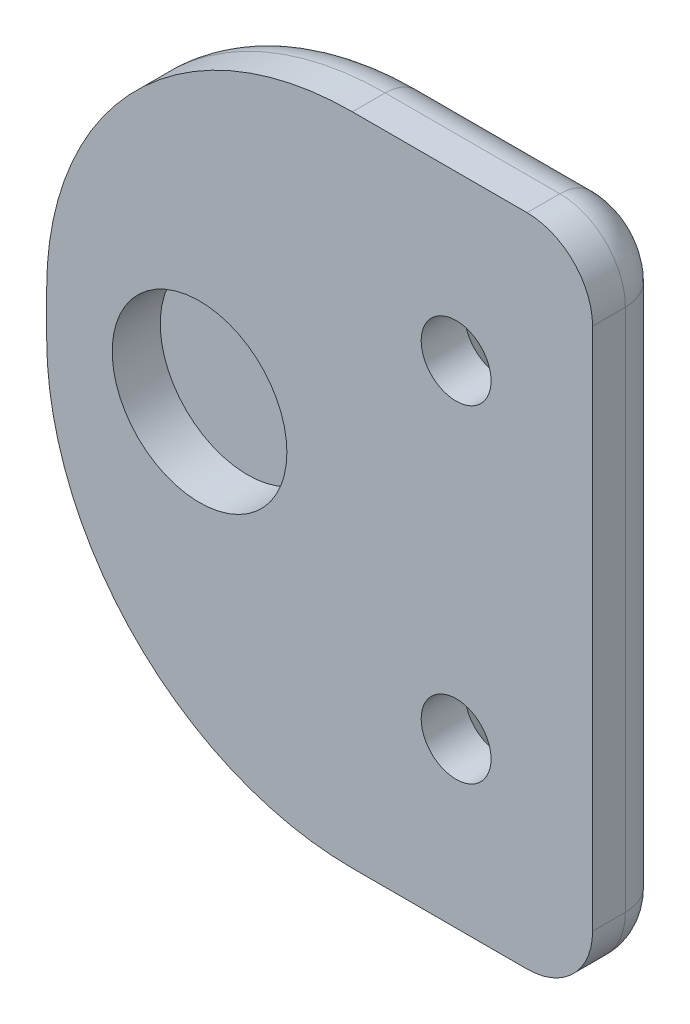
ISO-10303-21;
HEADER;
FILE_DESCRIPTION(('STEP AP214'),'2;1');
FILE_NAME('part.step','',(''),(''),'','','');
FILE_SCHEMA(('AUTOMOTIVE_DESIGN { 1 0 10303 214 1 1 1 1 }'));
ENDSEC;
DATA;
#1=APPLICATION_CONTEXT('core data for automotive mechanical design processes');
#2=APPLICATION_PROTOCOL_DEFINITION('international standard','automotive_design',2000,#1);
#3=PRODUCT_CONTEXT('',#1,'mechanical');
#4=PRODUCT('Part','Part','',(#3));
#5=PRODUCT_RELATED_PRODUCT_CATEGORY('part','',(#4));
#6=PRODUCT_DEFINITION_FORMATION('','',#4);
#7=PRODUCT_DEFINITION_CONTEXT('part definition',#1,'design');
#8=PRODUCT_DEFINITION('design','',#6,#7);
#9=PRODUCT_DEFINITION_SHAPE('','',#8);
#10=(LENGTH_UNIT() NAMED_UNIT(*) SI_UNIT(.MILLI.,.METRE.));
#11=(NAMED_UNIT(*) PLANE_ANGLE_UNIT() SI_UNIT($,.RADIAN.));
#12=(NAMED_UNIT(*) SI_UNIT($,.STERADIAN.) SOLID_ANGLE_UNIT());
#13=UNCERTAINTY_MEASURE_WITH_UNIT(LENGTH_MEASURE(1.E-05),#10,'distance_accuracy_value','');
#14=(GEOMETRIC_REPRESENTATION_CONTEXT(3) GLOBAL_UNCERTAINTY_ASSIGNED_CONTEXT((#13)) GLOBAL_UNIT_ASSIGNED_CONTEXT((#10,
#11,#12)) REPRESENTATION_CONTEXT('',''));
#15=CARTESIAN_POINT('',(0.,0.,0.));
#16=DIRECTION('',(0.,0.,1.));
#17=DIRECTION('',(1.,0.,0.));
#18=AXIS2_PLACEMENT_3D('',#15,#16,#17);
#19=CARTESIAN_POINT('',(9.50000000000001,-12.,3.5));
#20=DIRECTION('',(0.,0.,-1.));
#21=DIRECTION('',(-1.,0.,0.));
#22=AXIS2_PLACEMENT_3D('',#19,#20,#21);
#23=PLANE('',#22);
#24=CARTESIAN_POINT('',(-5.49999999999999,0.,3.5));
#25=DIRECTION('',(0.,0.,1.));
#26=DIRECTION('',(1.,0.,0.));
#27=AXIS2_PLACEMENT_3D('',#24,#25,#26);
#28=CIRCLE('',#27,4.);
#29=CARTESIAN_POINT('',(-1.49999999999999,0.,3.5));
#30=VERTEX_POINT('',#29);
#31=EDGE_CURVE('E203',#30,#30,#28,.T.);
#32=ORIENTED_EDGE('',*,*,#31,.F.);
#33=EDGE_LOOP('',(#32));
#34=FACE_BOUND('',#33,.T.);
#35=CARTESIAN_POINT('',(9.50000000000001,-12.,3.5));
#36=DIRECTION('',(0.,0.,1.));
#37=DIRECTION('',(-1.,0.,0.));
#38=AXIS2_PLACEMENT_3D('',#35,#36,#37);
#39=CIRCLE('',#38,3.);
#40=CARTESIAN_POINT('',(9.49999999999998,-15.,3.5));
#41=VERTEX_POINT('',#40);
#42=CARTESIAN_POINT('',(12.5,-12.,3.5));
#43=VERTEX_POINT('',#42);
#44=EDGE_CURVE('E130',#41,#43,#39,.T.);
#45=ORIENTED_EDGE('',*,*,#44,.T.);
#46=DIRECTION('',(0.,1.,0.));
#47=VECTOR('',#46,1.);
#48=CARTESIAN_POINT('',(12.5,12.,3.5));
#49=LINE('',#48,#47);
#50=CARTESIAN_POINT('',(12.5,12.,3.5));
#51=VERTEX_POINT('',#50);
#52=EDGE_CURVE('E121',#43,#51,#49,.T.);
#53=ORIENTED_EDGE('',*,*,#52,.T.);
#54=CARTESIAN_POINT('',(9.5,12.,3.5));
#55=DIRECTION('',(0.,0.,1.));
#56=DIRECTION('',(1.,0.,0.));
#57=AXIS2_PLACEMENT_3D('',#54,#55,#56);
#58=CIRCLE('',#57,3.);
#59=CARTESIAN_POINT('',(9.49999999999998,15.,3.5));
#60=VERTEX_POINT('',#59);
#61=EDGE_CURVE('E129',#51,#60,#58,.T.);
#62=ORIENTED_EDGE('',*,*,#61,.T.);
#63=DIRECTION('',(-1.,0.,0.));
#64=VECTOR('',#63,1.);
#65=CARTESIAN_POINT('',(1.5000000000001,15.,3.5));
#66=LINE('',#65,#64);
#67=CARTESIAN_POINT('',(1.5000000000001,15.,3.5));
#68=VERTEX_POINT('',#67);
#69=EDGE_CURVE('E293',#60,#68,#66,.T.);
#70=ORIENTED_EDGE('',*,*,#69,.T.);
#71=CARTESIAN_POINT('',(1.5,0.999999999999999,3.5));
#72=DIRECTION('',(0.,0.,1.));
#73=DIRECTION('',(1.,0.,0.));
#74=AXIS2_PLACEMENT_3D('',#71,#72,#73);
#75=CIRCLE('',#74,14.);
#76=CARTESIAN_POINT('',(-12.5,0.999999999999901,3.5));
#77=VERTEX_POINT('',#76);
#78=EDGE_CURVE('E256',#68,#77,#75,.T.);
#79=ORIENTED_EDGE('',*,*,#78,.T.);
#80=DIRECTION('',(0.,-1.,0.));
#81=VECTOR('',#80,1.);
#82=CARTESIAN_POINT('',(-12.5,0.9999999999999,3.5));
#83=LINE('',#82,#81);
#84=CARTESIAN_POINT('',(-12.5,-0.9999999999999,3.5));
#85=VERTEX_POINT('',#84);
#86=EDGE_CURVE('E290',#77,#85,#83,.T.);
#87=ORIENTED_EDGE('',*,*,#86,.T.);
#88=CARTESIAN_POINT('',(1.5,-0.999999999999997,3.5));
#89=DIRECTION('',(0.,0.,1.));
#90=DIRECTION('',(1.,0.,0.));
#91=AXIS2_PLACEMENT_3D('',#88,#89,#90);
#92=CIRCLE('',#91,14.);
#93=CARTESIAN_POINT('',(1.5000000000001,-15.,3.5));
#94=VERTEX_POINT('',#93);
#95=EDGE_CURVE('E280',#85,#94,#92,.T.);
#96=ORIENTED_EDGE('',*,*,#95,.T.);
#97=DIRECTION('',(1.,0.,0.));
#98=VECTOR('',#97,1.);
#99=CARTESIAN_POINT('',(1.5000000000001,-15.,3.5));
#100=LINE('',#99,#98);
#101=EDGE_CURVE('E135',#94,#41,#100,.T.);
#102=ORIENTED_EDGE('',*,*,#101,.T.);
#103=EDGE_LOOP('',(#45,#53,#62,#70,#79,#87,#96,#102));
#104=FACE_BOUND('',#103,.T.);
#105=CARTESIAN_POINT('',(6.25,7.5,3.5));
#106=DIRECTION('',(0.,0.,1.));
#107=DIRECTION('',(1.,0.,0.));
#108=AXIS2_PLACEMENT_3D('',#105,#106,#107);
#109=CIRCLE('',#108,1.6);
#110=CARTESIAN_POINT('',(7.85,7.5,3.5));
#111=VERTEX_POINT('',#110);
#112=EDGE_CURVE('E139',#111,#111,#109,.T.);
#113=ORIENTED_EDGE('',*,*,#112,.F.);
#114=EDGE_LOOP('',(#113));
#115=FACE_BOUND('',#114,.T.);
#116=CARTESIAN_POINT('',(6.25000000000001,-7.5,3.5));
#117=DIRECTION('',(0.,0.,1.));
#118=DIRECTION('',(1.,0.,0.));
#119=AXIS2_PLACEMENT_3D('',#116,#117,#118);
#120=CIRCLE('',#119,1.6);
#121=CARTESIAN_POINT('',(7.85000000000001,-7.5,3.5));
#122=VERTEX_POINT('',#121);
#123=EDGE_CURVE('E298',#122,#122,#120,.T.);
#124=ORIENTED_EDGE('',*,*,#123,.F.);
#125=EDGE_LOOP('',(#124));
#126=FACE_BOUND('',#125,.T.);
#127=ADVANCED_FACE('F32',(#34,#104,#115,#126),#23,.F.);
#128=CARTESIAN_POINT('',(9.50000000000001,-12.,0.));
#129=DIRECTION('',(0.,0.,-1.));
#130=DIRECTION('',(-1.,0.,0.));
#131=AXIS2_PLACEMENT_3D('',#128,#129,#130);
#132=PLANE('',#131);
#133=CARTESIAN_POINT('',(6.25000000000001,-7.5,0.));
#134=DIRECTION('',(0.,0.,-1.));
#135=DIRECTION('',(-1.,0.,0.));
#136=AXIS2_PLACEMENT_3D('',#133,#134,#135);
#137=CIRCLE('',#136,3.09999999999999);
#138=CARTESIAN_POINT('',(3.15000000000001,-7.5,0.));
#139=VERTEX_POINT('',#138);
#140=EDGE_CURVE('E206',#139,#139,#137,.F.);
#141=ORIENTED_EDGE('',*,*,#140,.T.);
#142=EDGE_LOOP('',(#141));
#143=FACE_BOUND('',#142,.T.);
#144=CARTESIAN_POINT('',(6.25,7.5,0.));
#145=DIRECTION('',(0.,0.,-1.));
#146=DIRECTION('',(-1.,0.,0.));
#147=AXIS2_PLACEMENT_3D('',#144,#145,#146);
#148=CIRCLE('',#147,3.09999999999999);
#149=CARTESIAN_POINT('',(3.15000000000001,7.5,0.));
#150=VERTEX_POINT('',#149);
#151=EDGE_CURVE('E180',#150,#150,#148,.F.);
#152=ORIENTED_EDGE('',*,*,#151,.T.);
#153=EDGE_LOOP('',(#152));
#154=FACE_BOUND('',#153,.T.);
#155=DIRECTION('',(0.,1.,0.));
#156=VECTOR('',#155,1.);
#157=CARTESIAN_POINT('',(10.5,-12.,0.));
#158=LINE('',#157,#156);
#159=CARTESIAN_POINT('',(10.5,12.,0.));
#160=VERTEX_POINT('',#159);
#161=CARTESIAN_POINT('',(10.5,-12.,0.));
#162=VERTEX_POINT('',#161);
#163=EDGE_CURVE('E146',#160,#162,#158,.F.);
#164=ORIENTED_EDGE('',*,*,#163,.T.);
#165=CARTESIAN_POINT('',(9.50000000000001,-12.,0.));
#166=DIRECTION('',(0.,0.,-1.));
#167=DIRECTION('',(-1.,0.,0.));
#168=AXIS2_PLACEMENT_3D('',#165,#166,#167);
#169=CIRCLE('',#168,1.);
#170=CARTESIAN_POINT('',(9.5,-13.,0.));
#171=VERTEX_POINT('',#170);
#172=EDGE_CURVE('E165',#162,#171,#169,.T.);
#173=ORIENTED_EDGE('',*,*,#172,.T.);
#174=DIRECTION('',(1.,0.,0.));
#175=VECTOR('',#174,1.);
#176=CARTESIAN_POINT('',(1.5000000000001,-13.,0.));
#177=LINE('',#176,#175);
#178=CARTESIAN_POINT('',(1.5000000000001,-13.,0.));
#179=VERTEX_POINT('',#178);
#180=EDGE_CURVE('E163',#171,#179,#177,.F.);
#181=ORIENTED_EDGE('',*,*,#180,.T.);
#182=CARTESIAN_POINT('',(1.5,-0.999999999999997,0.));
#183=DIRECTION('',(0.,0.,-1.));
#184=DIRECTION('',(-1.,0.,0.));
#185=AXIS2_PLACEMENT_3D('',#182,#183,#184);
#186=CIRCLE('',#185,12.);
#187=CARTESIAN_POINT('',(-10.5,-0.999999999999914,0.));
#188=VERTEX_POINT('',#187);
#189=EDGE_CURVE('E161',#179,#188,#186,.T.);
#190=ORIENTED_EDGE('',*,*,#189,.T.);
#191=DIRECTION('',(0.,-1.,0.));
#192=VECTOR('',#191,1.);
#193=CARTESIAN_POINT('',(-10.5,0.999999999999901,0.));
#194=LINE('',#193,#192);
#195=CARTESIAN_POINT('',(-10.5,0.999999999999901,0.));
#196=VERTEX_POINT('',#195);
#197=EDGE_CURVE('E159',#188,#196,#194,.F.);
#198=ORIENTED_EDGE('',*,*,#197,.T.);
#199=CARTESIAN_POINT('',(1.5,0.999999999999999,0.));
#200=DIRECTION('',(0.,0.,-1.));
#201=DIRECTION('',(-1.,0.,0.));
#202=AXIS2_PLACEMENT_3D('',#199,#200,#201);
#203=CIRCLE('',#202,12.);
#204=CARTESIAN_POINT('',(1.50000000000009,13.,0.));
#205=VERTEX_POINT('',#204);
#206=EDGE_CURVE('E157',#196,#205,#203,.T.);
#207=ORIENTED_EDGE('',*,*,#206,.T.);
#208=DIRECTION('',(-1.,0.,0.));
#209=VECTOR('',#208,1.);
#210=CARTESIAN_POINT('',(9.49999999999998,13.,0.));
#211=LINE('',#210,#209);
#212=CARTESIAN_POINT('',(9.49999999999998,13.,0.));
#213=VERTEX_POINT('',#212);
#214=EDGE_CURVE('E155',#205,#213,#211,.F.);
#215=ORIENTED_EDGE('',*,*,#214,.T.);
#216=CARTESIAN_POINT('',(9.5,12.,0.));
#217=DIRECTION('',(0.,0.,-1.));
#218=DIRECTION('',(-1.,0.,0.));
#219=AXIS2_PLACEMENT_3D('',#216,#217,#218);
#220=CIRCLE('',#219,1.);
#221=EDGE_CURVE('E153',#213,#160,#220,.T.);
#222=ORIENTED_EDGE('',*,*,#221,.T.);
#223=EDGE_LOOP('',(#164,#173,#181,#190,#198,#207,#215,#222));
#224=FACE_BOUND('',#223,.T.);
#225=ADVANCED_FACE('F220',(#143,#154,#224),#132,.T.);
#226=CARTESIAN_POINT('',(9.50000000000001,-12.,3.5));
#227=DIRECTION('',(0.,0.,-1.));
#228=DIRECTION('',(-1.,0.,0.));
#229=AXIS2_PLACEMENT_3D('',#226,#227,#228);
#230=CYLINDRICAL_SURFACE('',#229,3.);
#231=DIRECTION('',(0.,0.,-1.));
#232=VECTOR('',#231,1.);
#233=CARTESIAN_POINT('',(9.49999999999998,-15.,3.5));
#234=LINE('',#233,#232);
#235=CARTESIAN_POINT('',(9.49999999999998,-15.,2.));
#236=VERTEX_POINT('',#235);
#237=EDGE_CURVE('E284',#41,#236,#234,.T.);
#238=ORIENTED_EDGE('',*,*,#237,.T.);
#239=CARTESIAN_POINT('',(9.50000000000001,-12.,2.));
#240=DIRECTION('',(0.,0.,-1.));
#241=DIRECTION('',(-1.,0.,0.));
#242=AXIS2_PLACEMENT_3D('',#239,#240,#241);
#243=CIRCLE('',#242,3.);
#244=CARTESIAN_POINT('',(12.5,-12.,2.));
#245=VERTEX_POINT('',#244);
#246=EDGE_CURVE('E144',#236,#245,#243,.F.);
#247=ORIENTED_EDGE('',*,*,#246,.T.);
#248=DIRECTION('',(0.,0.,-1.));
#249=VECTOR('',#248,1.);
#250=CARTESIAN_POINT('',(12.5,-12.,3.5));
#251=LINE('',#250,#249);
#252=EDGE_CURVE('E125',#43,#245,#251,.T.);
#253=ORIENTED_EDGE('',*,*,#252,.F.);
#254=ORIENTED_EDGE('',*,*,#44,.F.);
#255=EDGE_LOOP('',(#238,#247,#253,#254));
#256=FACE_BOUND('',#255,.T.);
#257=ADVANCED_FACE('F142',(#256),#230,.T.);
#258=CARTESIAN_POINT('',(12.5,12.,3.5));
#259=DIRECTION('',(-1.,0.,0.));
#260=DIRECTION('',(0.,-1.,0.));
#261=AXIS2_PLACEMENT_3D('',#258,#259,#260);
#262=PLANE('',#261);
#263=ORIENTED_EDGE('',*,*,#252,.T.);
#264=DIRECTION('',(0.,1.,0.));
#265=VECTOR('',#264,1.);
#266=CARTESIAN_POINT('',(12.5,12.,2.));
#267=LINE('',#266,#265);
#268=CARTESIAN_POINT('',(12.5,12.,2.));
#269=VERTEX_POINT('',#268);
#270=EDGE_CURVE('E47',#245,#269,#267,.T.);
#271=ORIENTED_EDGE('',*,*,#270,.T.);
#272=DIRECTION('',(0.,0.,-1.));
#273=VECTOR('',#272,1.);
#274=CARTESIAN_POINT('',(12.5,12.,3.5));
#275=LINE('',#274,#273);
#276=EDGE_CURVE('E126',#51,#269,#275,.T.);
#277=ORIENTED_EDGE('',*,*,#276,.F.);
#278=ORIENTED_EDGE('',*,*,#52,.F.);
#279=EDGE_LOOP('',(#263,#271,#277,#278));
#280=FACE_BOUND('',#279,.T.);
#281=ADVANCED_FACE('F123',(#280),#262,.F.);
#282=CARTESIAN_POINT('',(9.5,12.,3.5));
#283=DIRECTION('',(0.,0.,-1.));
#284=DIRECTION('',(-1.,0.,0.));
#285=AXIS2_PLACEMENT_3D('',#282,#283,#284);
#286=CYLINDRICAL_SURFACE('',#285,3.);
#287=ORIENTED_EDGE('',*,*,#276,.T.);
#288=CARTESIAN_POINT('',(9.5,12.,2.));
#289=DIRECTION('',(0.,0.,-1.));
#290=DIRECTION('',(-1.,0.,0.));
#291=AXIS2_PLACEMENT_3D('',#288,#289,#290);
#292=CIRCLE('',#291,3.);
#293=CARTESIAN_POINT('',(9.49999999999998,15.,2.));
#294=VERTEX_POINT('',#293);
#295=EDGE_CURVE('E54',#269,#294,#292,.F.);
#296=ORIENTED_EDGE('',*,*,#295,.T.);
#297=DIRECTION('',(0.,0.,-1.));
#298=VECTOR('',#297,1.);
#299=CARTESIAN_POINT('',(9.49999999999998,15.,3.5));
#300=LINE('',#299,#298);
#301=EDGE_CURVE('E148',#60,#294,#300,.T.);
#302=ORIENTED_EDGE('',*,*,#301,.F.);
#303=ORIENTED_EDGE('',*,*,#61,.F.);
#304=EDGE_LOOP('',(#287,#296,#302,#303));
#305=FACE_BOUND('',#304,.T.);
#306=ADVANCED_FACE('F335',(#305),#286,.T.);
#307=CARTESIAN_POINT('',(1.5000000000001,15.,3.5));
#308=DIRECTION('',(0.,-1.,0.));
#309=DIRECTION('',(0.,0.,-1.));
#310=AXIS2_PLACEMENT_3D('',#307,#308,#309);
#311=PLANE('',#310);
#312=ORIENTED_EDGE('',*,*,#301,.T.);
#313=DIRECTION('',(-1.,0.,0.));
#314=VECTOR('',#313,1.);
#315=CARTESIAN_POINT('',(1.5000000000001,15.,2.));
#316=LINE('',#315,#314);
#317=CARTESIAN_POINT('',(1.5000000000001,15.,2.));
#318=VERTEX_POINT('',#317);
#319=EDGE_CURVE('E176',#294,#318,#316,.T.);
#320=ORIENTED_EDGE('',*,*,#319,.T.);
#321=DIRECTION('',(0.,0.,-1.));
#322=VECTOR('',#321,1.);
#323=CARTESIAN_POINT('',(1.5000000000001,15.,3.5));
#324=LINE('',#323,#322);
#325=EDGE_CURVE('E249',#68,#318,#324,.T.);
#326=ORIENTED_EDGE('',*,*,#325,.F.);
#327=ORIENTED_EDGE('',*,*,#69,.F.);
#328=EDGE_LOOP('',(#312,#320,#326,#327));
#329=FACE_BOUND('',#328,.T.);
#330=ADVANCED_FACE('F247',(#329),#311,.F.);
#331=CARTESIAN_POINT('',(1.5,0.999999999999999,3.5));
#332=DIRECTION('',(0.,0.,-1.));
#333=DIRECTION('',(-1.,0.,0.));
#334=AXIS2_PLACEMENT_3D('',#331,#332,#333);
#335=CYLINDRICAL_SURFACE('',#334,14.);
#336=ORIENTED_EDGE('',*,*,#325,.T.);
#337=CARTESIAN_POINT('',(1.5,0.999999999999999,2.));
#338=DIRECTION('',(0.,0.,-1.));
#339=DIRECTION('',(-1.,0.,0.));
#340=AXIS2_PLACEMENT_3D('',#337,#338,#339);
#341=CIRCLE('',#340,14.);
#342=CARTESIAN_POINT('',(-12.5,0.999999999999901,2.));
#343=VERTEX_POINT('',#342);
#344=EDGE_CURVE('E174',#318,#343,#341,.F.);
#345=ORIENTED_EDGE('',*,*,#344,.T.);
#346=DIRECTION('',(0.,0.,-1.));
#347=VECTOR('',#346,1.);
#348=CARTESIAN_POINT('',(-12.5,0.999999999999901,3.5));
#349=LINE('',#348,#347);
#350=EDGE_CURVE('E257',#77,#343,#349,.T.);
#351=ORIENTED_EDGE('',*,*,#350,.F.);
#352=ORIENTED_EDGE('',*,*,#78,.F.);
#353=EDGE_LOOP('',(#336,#345,#351,#352));
#354=FACE_BOUND('',#353,.T.);
#355=ADVANCED_FACE('F253',(#354),#335,.T.);
#356=CARTESIAN_POINT('',(-12.5,0.9999999999999,3.5));
#357=DIRECTION('',(1.,0.,0.));
#358=DIRECTION('',(0.,0.,-1.));
#359=AXIS2_PLACEMENT_3D('',#356,#357,#358);
#360=PLANE('',#359);
#361=ORIENTED_EDGE('',*,*,#350,.T.);
#362=DIRECTION('',(0.,-1.,0.));
#363=VECTOR('',#362,1.);
#364=CARTESIAN_POINT('',(-12.5,-0.9999999999999,2.));
#365=LINE('',#364,#363);
#366=CARTESIAN_POINT('',(-12.5,-0.9999999999999,2.));
#367=VERTEX_POINT('',#366);
#368=EDGE_CURVE('E172',#343,#367,#365,.T.);
#369=ORIENTED_EDGE('',*,*,#368,.T.);
#370=DIRECTION('',(0.,0.,-1.));
#371=VECTOR('',#370,1.);
#372=CARTESIAN_POINT('',(-12.5,-0.9999999999999,3.5));
#373=LINE('',#372,#371);
#374=EDGE_CURVE('E274',#85,#367,#373,.T.);
#375=ORIENTED_EDGE('',*,*,#374,.F.);
#376=ORIENTED_EDGE('',*,*,#86,.F.);
#377=EDGE_LOOP('',(#361,#369,#375,#376));
#378=FACE_BOUND('',#377,.T.);
#379=ADVANCED_FACE('F272',(#378),#360,.F.);
#380=CARTESIAN_POINT('',(1.5,-0.999999999999997,3.5));
#381=DIRECTION('',(0.,0.,-1.));
#382=DIRECTION('',(-1.,0.,0.));
#383=AXIS2_PLACEMENT_3D('',#380,#381,#382);
#384=CYLINDRICAL_SURFACE('',#383,14.);
#385=ORIENTED_EDGE('',*,*,#374,.T.);
#386=CARTESIAN_POINT('',(1.5,-0.999999999999997,2.));
#387=DIRECTION('',(0.,0.,-1.));
#388=DIRECTION('',(-1.,0.,0.));
#389=AXIS2_PLACEMENT_3D('',#386,#387,#388);
#390=CIRCLE('',#389,14.);
#391=CARTESIAN_POINT('',(1.5000000000001,-15.,2.));
#392=VERTEX_POINT('',#391);
#393=EDGE_CURVE('E170',#367,#392,#390,.F.);
#394=ORIENTED_EDGE('',*,*,#393,.T.);
#395=DIRECTION('',(0.,0.,-1.));
#396=VECTOR('',#395,1.);
#397=CARTESIAN_POINT('',(1.5000000000001,-15.,3.5));
#398=LINE('',#397,#396);
#399=EDGE_CURVE('E281',#94,#392,#398,.T.);
#400=ORIENTED_EDGE('',*,*,#399,.F.);
#401=ORIENTED_EDGE('',*,*,#95,.F.);
#402=EDGE_LOOP('',(#385,#394,#400,#401));
#403=FACE_BOUND('',#402,.T.);
#404=ADVANCED_FACE('F277',(#403),#384,.T.);
#405=CARTESIAN_POINT('',(1.5000000000001,-15.,3.5));
#406=DIRECTION('',(0.,1.,0.));
#407=DIRECTION('',(0.,0.,1.));
#408=AXIS2_PLACEMENT_3D('',#405,#406,#407);
#409=PLANE('',#408);
#410=ORIENTED_EDGE('',*,*,#399,.T.);
#411=DIRECTION('',(1.,0.,0.));
#412=VECTOR('',#411,1.);
#413=CARTESIAN_POINT('',(9.49999999999998,-15.,2.));
#414=LINE('',#413,#412);
#415=EDGE_CURVE('E168',#392,#236,#414,.T.);
#416=ORIENTED_EDGE('',*,*,#415,.T.);
#417=ORIENTED_EDGE('',*,*,#237,.F.);
#418=ORIENTED_EDGE('',*,*,#101,.F.);
#419=EDGE_LOOP('',(#410,#416,#417,#418));
#420=FACE_BOUND('',#419,.T.);
#421=ADVANCED_FACE('F323',(#420),#409,.F.);
#422=CARTESIAN_POINT('',(6.25,7.5,3.5));
#423=DIRECTION('',(0.,0.,-1.));
#424=DIRECTION('',(-1.,0.,0.));
#425=AXIS2_PLACEMENT_3D('',#422,#423,#424);
#426=CYLINDRICAL_SURFACE('',#425,1.6);
#427=CARTESIAN_POINT('',(6.25,7.5,1.5));
#428=DIRECTION('',(0.,0.,-1.));
#429=DIRECTION('',(-1.,0.,0.));
#430=AXIS2_PLACEMENT_3D('',#427,#428,#429);
#431=CIRCLE('',#430,1.6);
#432=CARTESIAN_POINT('',(4.65,7.5,1.5));
#433=VERTEX_POINT('',#432);
#434=EDGE_CURVE('E11',#433,#433,#431,.T.);
#435=ORIENTED_EDGE('',*,*,#434,.T.);
#436=EDGE_LOOP('',(#435));
#437=FACE_BOUND('',#436,.T.);
#438=ORIENTED_EDGE('',*,*,#112,.T.);
#439=EDGE_LOOP('',(#438));
#440=FACE_BOUND('',#439,.T.);
#441=ADVANCED_FACE('F320',(#437,#440),#426,.F.);
#442=CARTESIAN_POINT('',(6.25000000000001,-7.5,3.5));
#443=DIRECTION('',(0.,0.,-1.));
#444=DIRECTION('',(-1.,0.,0.));
#445=AXIS2_PLACEMENT_3D('',#442,#443,#444);
#446=CYLINDRICAL_SURFACE('',#445,1.6);
#447=CARTESIAN_POINT('',(6.25000000000001,-7.5,1.5));
#448=DIRECTION('',(0.,0.,-1.));
#449=DIRECTION('',(-1.,0.,0.));
#450=AXIS2_PLACEMENT_3D('',#447,#448,#449);
#451=CIRCLE('',#450,1.6);
#452=CARTESIAN_POINT('',(4.65,-7.5,1.5));
#453=VERTEX_POINT('',#452);
#454=EDGE_CURVE('E40',#453,#453,#451,.T.);
#455=ORIENTED_EDGE('',*,*,#454,.T.);
#456=EDGE_LOOP('',(#455));
#457=FACE_BOUND('',#456,.T.);
#458=ORIENTED_EDGE('',*,*,#123,.T.);
#459=EDGE_LOOP('',(#458));
#460=FACE_BOUND('',#459,.T.);
#461=ADVANCED_FACE('F211',(#457,#460),#446,.F.);
#462=CARTESIAN_POINT('',(-5.49999999999999,0.,1.3));
#463=DIRECTION('',(0.,0.,1.));
#464=DIRECTION('',(1.,0.,0.));
#465=AXIS2_PLACEMENT_3D('',#462,#463,#464);
#466=CYLINDRICAL_SURFACE('',#465,4.);
#467=CARTESIAN_POINT('',(-5.49999999999999,0.,1.3));
#468=DIRECTION('',(0.,0.,1.));
#469=DIRECTION('',(1.,0.,0.));
#470=AXIS2_PLACEMENT_3D('',#467,#468,#469);
#471=CIRCLE('',#470,4.);
#472=CARTESIAN_POINT('',(-1.49999999999999,0.,1.3));
#473=VERTEX_POINT('',#472);
#474=EDGE_CURVE('E301',#473,#473,#471,.T.);
#475=ORIENTED_EDGE('',*,*,#474,.F.);
#476=EDGE_LOOP('',(#475));
#477=FACE_BOUND('',#476,.T.);
#478=ORIENTED_EDGE('',*,*,#31,.T.);
#479=EDGE_LOOP('',(#478));
#480=FACE_BOUND('',#479,.T.);
#481=ADVANCED_FACE('F309',(#477,#480),#466,.F.);
#482=CARTESIAN_POINT('',(-5.49999999999999,0.,1.3));
#483=DIRECTION('',(0.,0.,1.));
#484=DIRECTION('',(1.,0.,0.));
#485=AXIS2_PLACEMENT_3D('',#482,#483,#484);
#486=PLANE('',#485);
#487=ORIENTED_EDGE('',*,*,#474,.T.);
#488=EDGE_LOOP('',(#487));
#489=FACE_BOUND('',#488,.T.);
#490=ADVANCED_FACE('F307',(#489),#486,.T.);
#491=CARTESIAN_POINT('',(1.5,0.999999999999999,2.));
#492=DIRECTION('',(0.,0.,-1.));
#493=DIRECTION('',(-1.,0.,0.));
#494=AXIS2_PLACEMENT_3D('',#491,#492,#493);
#495=TOROIDAL_SURFACE('',#494,12.,2.);
#496=CARTESIAN_POINT('',(1.50000000000009,13.,2.));
#497=DIRECTION('',(1.,0.,0.));
#498=DIRECTION('',(0.,1.,0.));
#499=AXIS2_PLACEMENT_3D('',#496,#497,#498);
#500=CIRCLE('',#499,2.);
#501=EDGE_CURVE('E197',#205,#318,#500,.T.);
#502=ORIENTED_EDGE('',*,*,#501,.F.);
#503=ORIENTED_EDGE('',*,*,#206,.F.);
#504=CARTESIAN_POINT('',(-10.5,0.999999999999915,2.));
#505=DIRECTION('',(0.,-1.,0.));
#506=DIRECTION('',(0.,0.,-1.));
#507=AXIS2_PLACEMENT_3D('',#504,#505,#506);
#508=CIRCLE('',#507,2.);
#509=EDGE_CURVE('E200',#343,#196,#508,.T.);
#510=ORIENTED_EDGE('',*,*,#509,.F.);
#511=ORIENTED_EDGE('',*,*,#344,.F.);
#512=EDGE_LOOP('',(#502,#503,#510,#511));
#513=FACE_BOUND('',#512,.T.);
#514=ADVANCED_FACE('F261',(#513),#495,.T.);
#515=CARTESIAN_POINT('',(-10.5,0.9999999999999,2.));
#516=DIRECTION('',(0.,1.,0.));
#517=DIRECTION('',(0.,0.,1.));
#518=AXIS2_PLACEMENT_3D('',#515,#516,#517);
#519=CYLINDRICAL_SURFACE('',#518,2.);
#520=ORIENTED_EDGE('',*,*,#509,.T.);
#521=ORIENTED_EDGE('',*,*,#197,.F.);
#522=CARTESIAN_POINT('',(-10.5,-0.9999999999999,2.));
#523=DIRECTION('',(0.,-1.,0.));
#524=DIRECTION('',(0.,0.,-1.));
#525=AXIS2_PLACEMENT_3D('',#522,#523,#524);
#526=CIRCLE('',#525,2.);
#527=EDGE_CURVE('E194',#367,#188,#526,.T.);
#528=ORIENTED_EDGE('',*,*,#527,.F.);
#529=ORIENTED_EDGE('',*,*,#368,.F.);
#530=EDGE_LOOP('',(#520,#521,#528,#529));
#531=FACE_BOUND('',#530,.T.);
#532=ADVANCED_FACE('F267',(#531),#519,.T.);
#533=CARTESIAN_POINT('',(1.5000000000001,13.,2.));
#534=DIRECTION('',(1.,0.,0.));
#535=DIRECTION('',(0.,0.,-1.));
#536=AXIS2_PLACEMENT_3D('',#533,#534,#535);
#537=CYLINDRICAL_SURFACE('',#536,2.);
#538=ORIENTED_EDGE('',*,*,#501,.T.);
#539=ORIENTED_EDGE('',*,*,#319,.F.);
#540=CARTESIAN_POINT('',(9.49999999999998,13.,2.));
#541=DIRECTION('',(1.,0.,0.));
#542=DIRECTION('',(0.,0.,-1.));
#543=AXIS2_PLACEMENT_3D('',#540,#541,#542);
#544=CIRCLE('',#543,2.);
#545=EDGE_CURVE('E191',#213,#294,#544,.T.);
#546=ORIENTED_EDGE('',*,*,#545,.F.);
#547=ORIENTED_EDGE('',*,*,#214,.F.);
#548=EDGE_LOOP('',(#538,#539,#546,#547));
#549=FACE_BOUND('',#548,.T.);
#550=ADVANCED_FACE('F242',(#549),#537,.T.);
#551=CARTESIAN_POINT('',(1.5,-0.999999999999997,2.));
#552=DIRECTION('',(0.,0.,-1.));
#553=DIRECTION('',(-1.,0.,0.));
#554=AXIS2_PLACEMENT_3D('',#551,#552,#553);
#555=TOROIDAL_SURFACE('',#554,12.,2.);
#556=ORIENTED_EDGE('',*,*,#527,.T.);
#557=ORIENTED_EDGE('',*,*,#189,.F.);
#558=CARTESIAN_POINT('',(1.50000000000009,-13.,2.));
#559=DIRECTION('',(1.,0.,0.));
#560=DIRECTION('',(0.,0.,-1.));
#561=AXIS2_PLACEMENT_3D('',#558,#559,#560);
#562=CIRCLE('',#561,2.);
#563=EDGE_CURVE('E188',#392,#179,#562,.T.);
#564=ORIENTED_EDGE('',*,*,#563,.F.);
#565=ORIENTED_EDGE('',*,*,#393,.F.);
#566=EDGE_LOOP('',(#556,#557,#564,#565));
#567=FACE_BOUND('',#566,.T.);
#568=ADVANCED_FACE('F352',(#567),#555,.T.);
#569=CARTESIAN_POINT('',(9.5,12.,2.));
#570=DIRECTION('',(0.,0.,-1.));
#571=DIRECTION('',(-1.,0.,0.));
#572=AXIS2_PLACEMENT_3D('',#569,#570,#571);
#573=DEGENERATE_TOROIDAL_SURFACE('',#572,1.,2.,.T.);
#574=ORIENTED_EDGE('',*,*,#545,.T.);
#575=ORIENTED_EDGE('',*,*,#295,.F.);
#576=CARTESIAN_POINT('',(10.5,12.,2.));
#577=DIRECTION('',(0.,-1.,0.));
#578=DIRECTION('',(1.,0.,0.));
#579=AXIS2_PLACEMENT_3D('',#576,#577,#578);
#580=CIRCLE('',#579,2.);
#581=EDGE_CURVE('E185',#160,#269,#580,.T.);
#582=ORIENTED_EDGE('',*,*,#581,.F.);
#583=ORIENTED_EDGE('',*,*,#221,.F.);
#584=EDGE_LOOP('',(#574,#575,#582,#583));
#585=FACE_BOUND('',#584,.T.);
#586=ADVANCED_FACE('F237',(#585),#573,.T.);
#587=CARTESIAN_POINT('',(1.5000000000001,-13.,2.));
#588=DIRECTION('',(-1.,0.,0.));
#589=DIRECTION('',(0.,0.,1.));
#590=AXIS2_PLACEMENT_3D('',#587,#588,#589);
#591=CYLINDRICAL_SURFACE('',#590,2.);
#592=ORIENTED_EDGE('',*,*,#563,.T.);
#593=ORIENTED_EDGE('',*,*,#180,.F.);
#594=CARTESIAN_POINT('',(9.49999999999998,-13.,2.));
#595=DIRECTION('',(1.,0.,0.));
#596=DIRECTION('',(0.,0.,-1.));
#597=AXIS2_PLACEMENT_3D('',#594,#595,#596);
#598=CIRCLE('',#597,2.);
#599=EDGE_CURVE('E183',#236,#171,#598,.T.);
#600=ORIENTED_EDGE('',*,*,#599,.F.);
#601=ORIENTED_EDGE('',*,*,#415,.F.);
#602=EDGE_LOOP('',(#592,#593,#600,#601));
#603=FACE_BOUND('',#602,.T.);
#604=ADVANCED_FACE('F346',(#603),#591,.T.);
#605=CARTESIAN_POINT('',(10.5,12.,2.));
#606=DIRECTION('',(0.,-1.,0.));
#607=DIRECTION('',(1.,0.,0.));
#608=AXIS2_PLACEMENT_3D('',#605,#606,#607);
#609=CYLINDRICAL_SURFACE('',#608,2.);
#610=ORIENTED_EDGE('',*,*,#581,.T.);
#611=ORIENTED_EDGE('',*,*,#270,.F.);
#612=CARTESIAN_POINT('',(10.5,-12.,2.));
#613=DIRECTION('',(0.,-1.,0.));
#614=DIRECTION('',(1.,0.,0.));
#615=AXIS2_PLACEMENT_3D('',#612,#613,#614);
#616=CIRCLE('',#615,2.);
#617=EDGE_CURVE('E181',#162,#245,#616,.T.);
#618=ORIENTED_EDGE('',*,*,#617,.F.);
#619=ORIENTED_EDGE('',*,*,#163,.F.);
#620=EDGE_LOOP('',(#610,#611,#618,#619));
#621=FACE_BOUND('',#620,.T.);
#622=ADVANCED_FACE('F235',(#621),#609,.T.);
#623=CARTESIAN_POINT('',(9.50000000000001,-12.,2.));
#624=DIRECTION('',(0.,0.,-1.));
#625=DIRECTION('',(-1.,0.,0.));
#626=AXIS2_PLACEMENT_3D('',#623,#624,#625);
#627=DEGENERATE_TOROIDAL_SURFACE('',#626,1.,2.,.T.);
#628=ORIENTED_EDGE('',*,*,#599,.T.);
#629=ORIENTED_EDGE('',*,*,#172,.F.);
#630=ORIENTED_EDGE('',*,*,#617,.T.);
#631=ORIENTED_EDGE('',*,*,#246,.F.);
#632=EDGE_LOOP('',(#628,#629,#630,#631));
#633=FACE_BOUND('',#632,.T.);
#634=ADVANCED_FACE('F217',(#633),#627,.T.);
#635=CARTESIAN_POINT('',(6.25000000000001,-7.5,0.));
#636=DIRECTION('',(0.,0.,-1.));
#637=DIRECTION('',(-1.,0.,0.));
#638=AXIS2_PLACEMENT_3D('',#635,#636,#637);
#639=CONICAL_SURFACE('',#638,3.09999999999999,0.785398163397447);
#640=ORIENTED_EDGE('',*,*,#454,.F.);
#641=EDGE_LOOP('',(#640));
#642=FACE_BOUND('',#641,.T.);
#643=ORIENTED_EDGE('',*,*,#140,.F.);
#644=EDGE_LOOP('',(#643));
#645=FACE_BOUND('',#644,.T.);
#646=ADVANCED_FACE('F214',(#642,#645),#639,.F.);
#647=CARTESIAN_POINT('',(6.25,7.5,0.));
#648=DIRECTION('',(0.,0.,-1.));
#649=DIRECTION('',(-1.,0.,0.));
#650=AXIS2_PLACEMENT_3D('',#647,#648,#649);
#651=CONICAL_SURFACE('',#650,3.09999999999999,0.785398163397447);
#652=ORIENTED_EDGE('',*,*,#434,.F.);
#653=EDGE_LOOP('',(#652));
#654=FACE_BOUND('',#653,.T.);
#655=ORIENTED_EDGE('',*,*,#151,.F.);
#656=EDGE_LOOP('',(#655));
#657=FACE_BOUND('',#656,.T.);
#658=ADVANCED_FACE('F34',(#654,#657),#651,.F.);
#659=CLOSED_SHELL('',(#127,#225,#257,#281,#306,#330,#355,#379,#404,#421,#441,#461,#481,#490,
#514,#532,#550,#568,#586,#604,#622,#634,#646,#658));
#660=MANIFOLD_SOLID_BREP('B2',#659);
#661=ADVANCED_BREP_SHAPE_REPRESENTATION('',(#18,#660),#14);
#662=SHAPE_DEFINITION_REPRESENTATION(#9,#661);
ENDSEC;
END-ISO-10303-21;
